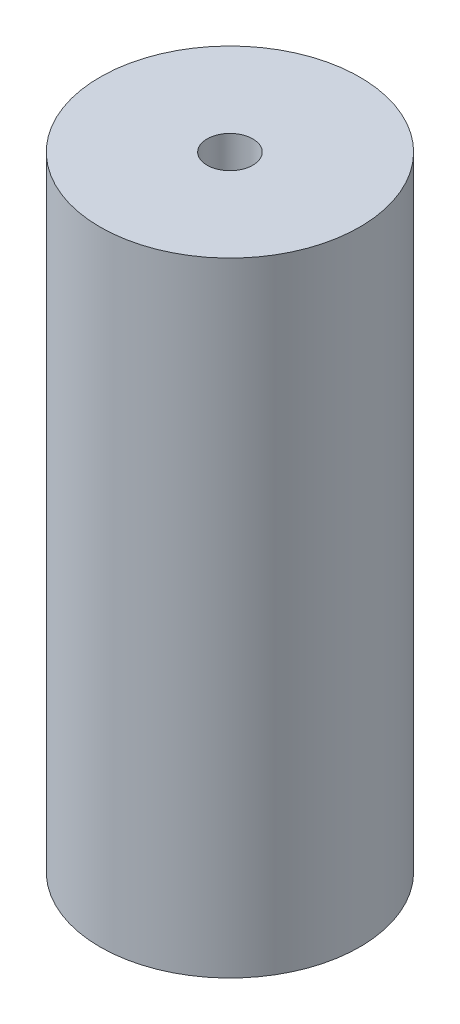
ISO-10303-21;
HEADER;
FILE_DESCRIPTION(('STEP AP214'),'2;1');
FILE_NAME('part.step','',(''),(''),'','','');
FILE_SCHEMA(('AUTOMOTIVE_DESIGN { 1 0 10303 214 1 1 1 1 }'));
ENDSEC;
DATA;
#1=APPLICATION_CONTEXT('core data for automotive mechanical design processes');
#2=APPLICATION_PROTOCOL_DEFINITION('international standard','automotive_design',2000,#1);
#3=PRODUCT_CONTEXT('',#1,'mechanical');
#4=PRODUCT('Part','Part','',(#3));
#5=PRODUCT_RELATED_PRODUCT_CATEGORY('part','',(#4));
#6=PRODUCT_DEFINITION_FORMATION('','',#4);
#7=PRODUCT_DEFINITION_CONTEXT('part definition',#1,'design');
#8=PRODUCT_DEFINITION('design','',#6,#7);
#9=PRODUCT_DEFINITION_SHAPE('','',#8);
#10=(LENGTH_UNIT() NAMED_UNIT(*) SI_UNIT(.MILLI.,.METRE.));
#11=(NAMED_UNIT(*) PLANE_ANGLE_UNIT() SI_UNIT($,.RADIAN.));
#12=(NAMED_UNIT(*) SI_UNIT($,.STERADIAN.) SOLID_ANGLE_UNIT());
#13=UNCERTAINTY_MEASURE_WITH_UNIT(LENGTH_MEASURE(1.E-05),#10,'distance_accuracy_value','');
#14=(GEOMETRIC_REPRESENTATION_CONTEXT(3) GLOBAL_UNCERTAINTY_ASSIGNED_CONTEXT((#13)) GLOBAL_UNIT_ASSIGNED_CONTEXT((#10,
#11,#12)) REPRESENTATION_CONTEXT('',''));
#15=CARTESIAN_POINT('',(0.,0.,0.));
#16=DIRECTION('',(0.,0.,1.));
#17=DIRECTION('',(1.,0.,0.));
#18=AXIS2_PLACEMENT_3D('',#15,#16,#17);
#19=CARTESIAN_POINT('',(0.,60.,0.));
#20=DIRECTION('',(0.,-1.,0.));
#21=DIRECTION('',(0.,0.,-1.));
#22=AXIS2_PLACEMENT_3D('',#19,#20,#21);
#23=CYLINDRICAL_SURFACE('',#22,12.5);
#24=CARTESIAN_POINT('',(0.,60.,0.));
#25=DIRECTION('',(0.,1.,0.));
#26=DIRECTION('',(0.,0.,1.));
#27=AXIS2_PLACEMENT_3D('',#24,#25,#26);
#28=CIRCLE('',#27,12.5);
#29=CARTESIAN_POINT('',(0.,60.,12.5));
#30=VERTEX_POINT('',#29);
#31=EDGE_CURVE('E10',#30,#30,#28,.T.);
#32=ORIENTED_EDGE('',*,*,#31,.F.);
#33=EDGE_LOOP('',(#32));
#34=FACE_BOUND('',#33,.T.);
#35=CARTESIAN_POINT('',(0.,0.,0.));
#36=DIRECTION('',(0.,1.,0.));
#37=DIRECTION('',(0.,0.,1.));
#38=AXIS2_PLACEMENT_3D('',#35,#36,#37);
#39=CIRCLE('',#38,12.5);
#40=CARTESIAN_POINT('',(0.,0.,12.5));
#41=VERTEX_POINT('',#40);
#42=EDGE_CURVE('E38',#41,#41,#39,.T.);
#43=ORIENTED_EDGE('',*,*,#42,.T.);
#44=EDGE_LOOP('',(#43));
#45=FACE_BOUND('',#44,.T.);
#46=ADVANCED_FACE('F35',(#34,#45),#23,.T.);
#47=CARTESIAN_POINT('',(0.,60.,0.));
#48=DIRECTION('',(0.,1.,0.));
#49=DIRECTION('',(0.,0.,1.));
#50=AXIS2_PLACEMENT_3D('',#47,#48,#49);
#51=PLANE('',#50);
#52=CARTESIAN_POINT('',(0.,60.,0.));
#53=DIRECTION('',(0.,-1.,0.));
#54=DIRECTION('',(0.,0.,-1.));
#55=AXIS2_PLACEMENT_3D('',#52,#53,#54);
#56=CIRCLE('',#55,2.2);
#57=CARTESIAN_POINT('',(0.,60.,-2.2));
#58=VERTEX_POINT('',#57);
#59=EDGE_CURVE('E45',#58,#58,#56,.T.);
#60=ORIENTED_EDGE('',*,*,#59,.T.);
#61=EDGE_LOOP('',(#60));
#62=FACE_BOUND('',#61,.T.);
#63=ORIENTED_EDGE('',*,*,#31,.T.);
#64=EDGE_LOOP('',(#63));
#65=FACE_BOUND('',#64,.T.);
#66=ADVANCED_FACE('F53',(#62,#65),#51,.T.);
#67=CARTESIAN_POINT('',(0.,0.,0.));
#68=DIRECTION('',(0.,1.,0.));
#69=DIRECTION('',(0.,0.,1.));
#70=AXIS2_PLACEMENT_3D('',#67,#68,#69);
#71=PLANE('',#70);
#72=CARTESIAN_POINT('',(0.,0.,0.));
#73=DIRECTION('',(0.,-1.,0.));
#74=DIRECTION('',(0.,0.,-1.));
#75=AXIS2_PLACEMENT_3D('',#72,#73,#74);
#76=CIRCLE('',#75,2.2);
#77=CARTESIAN_POINT('',(0.,0.,-2.2));
#78=VERTEX_POINT('',#77);
#79=EDGE_CURVE('E47',#78,#78,#76,.T.);
#80=ORIENTED_EDGE('',*,*,#79,.F.);
#81=EDGE_LOOP('',(#80));
#82=FACE_BOUND('',#81,.T.);
#83=ORIENTED_EDGE('',*,*,#42,.F.);
#84=EDGE_LOOP('',(#83));
#85=FACE_BOUND('',#84,.T.);
#86=ADVANCED_FACE('F58',(#82,#85),#71,.F.);
#87=CARTESIAN_POINT('',(0.,60.,0.));
#88=DIRECTION('',(0.,-1.,0.));
#89=DIRECTION('',(0.,0.,-1.));
#90=AXIS2_PLACEMENT_3D('',#87,#88,#89);
#91=CYLINDRICAL_SURFACE('',#90,2.2);
#92=ORIENTED_EDGE('',*,*,#59,.F.);
#93=EDGE_LOOP('',(#92));
#94=FACE_BOUND('',#93,.T.);
#95=ORIENTED_EDGE('',*,*,#79,.T.);
#96=EDGE_LOOP('',(#95));
#97=FACE_BOUND('',#96,.T.);
#98=ADVANCED_FACE('F55',(#94,#97),#91,.F.);
#99=CLOSED_SHELL('',(#46,#66,#86,#98));
#100=MANIFOLD_SOLID_BREP('B2',#99);
#101=ADVANCED_BREP_SHAPE_REPRESENTATION('',(#18,#100),#14);
#102=SHAPE_DEFINITION_REPRESENTATION(#9,#101);
ENDSEC;
END-ISO-10303-21;
